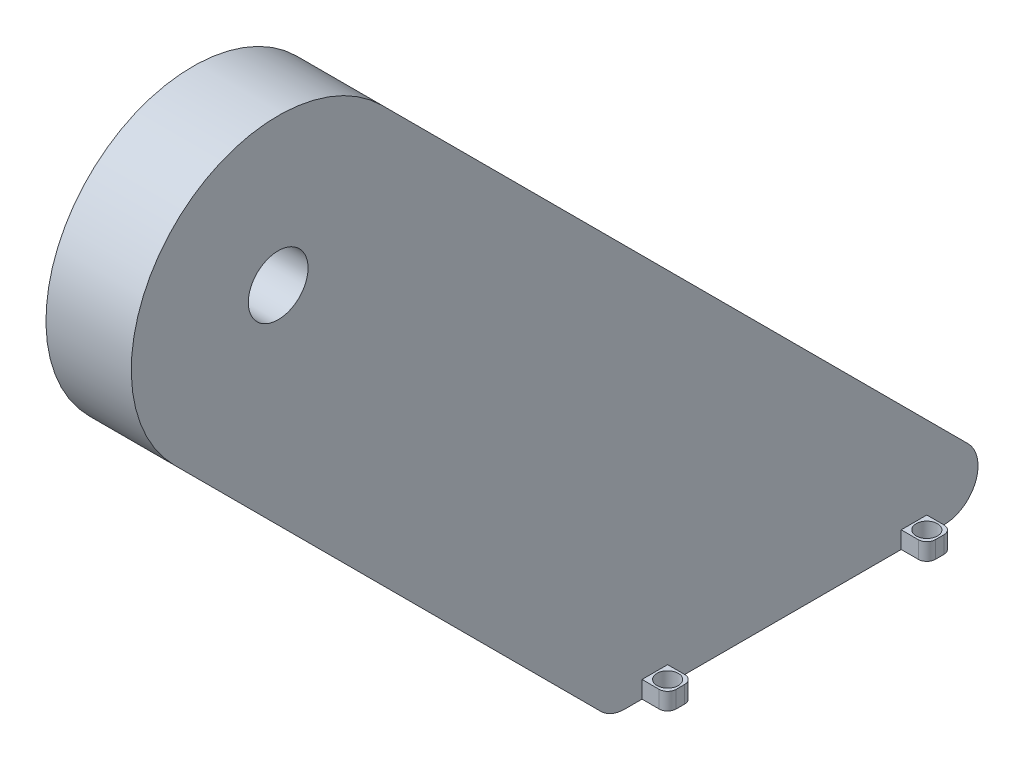
ISO-10303-21;
HEADER;
FILE_DESCRIPTION(('STEP AP214'),'2;1');
FILE_NAME('part.step','',(''),(''),'','','');
FILE_SCHEMA(('AUTOMOTIVE_DESIGN { 1 0 10303 214 1 1 1 1 }'));
ENDSEC;
DATA;
#1=APPLICATION_CONTEXT('core data for automotive mechanical design processes');
#2=APPLICATION_PROTOCOL_DEFINITION('international standard','automotive_design',2000,#1);
#3=PRODUCT_CONTEXT('',#1,'mechanical');
#4=PRODUCT('Part','Part','',(#3));
#5=PRODUCT_RELATED_PRODUCT_CATEGORY('part','',(#4));
#6=PRODUCT_DEFINITION_FORMATION('','',#4);
#7=PRODUCT_DEFINITION_CONTEXT('part definition',#1,'design');
#8=PRODUCT_DEFINITION('design','',#6,#7);
#9=PRODUCT_DEFINITION_SHAPE('','',#8);
#10=(LENGTH_UNIT() NAMED_UNIT(*) SI_UNIT(.MILLI.,.METRE.));
#11=(NAMED_UNIT(*) PLANE_ANGLE_UNIT() SI_UNIT($,.RADIAN.));
#12=(NAMED_UNIT(*) SI_UNIT($,.STERADIAN.) SOLID_ANGLE_UNIT());
#13=UNCERTAINTY_MEASURE_WITH_UNIT(LENGTH_MEASURE(1.E-05),#10,'distance_accuracy_value','');
#14=(GEOMETRIC_REPRESENTATION_CONTEXT(3) GLOBAL_UNCERTAINTY_ASSIGNED_CONTEXT((#13)) GLOBAL_UNIT_ASSIGNED_CONTEXT((#10,
#11,#12)) REPRESENTATION_CONTEXT('',''));
#15=CARTESIAN_POINT('',(0.,0.,0.));
#16=DIRECTION('',(0.,0.,1.));
#17=DIRECTION('',(1.,0.,0.));
#18=AXIS2_PLACEMENT_3D('',#15,#16,#17);
#19=CARTESIAN_POINT('',(10.,4.,-24.0294372494924));
#20=DIRECTION('',(1.,0.,0.));
#21=DIRECTION('',(0.,0.,-1.));
#22=AXIS2_PLACEMENT_3D('',#19,#20,#21);
#23=PLANE('',#22);
#24=DIRECTION('',(0.,-1.,0.));
#25=VECTOR('',#24,1.);
#26=CARTESIAN_POINT('',(10.,2.,-19.0294372494924));
#27=LINE('',#26,#25);
#28=CARTESIAN_POINT('',(10.,2.,-19.0294372494924));
#29=VERTEX_POINT('',#28);
#30=CARTESIAN_POINT('',(10.,0.,-19.0294372494924));
#31=VERTEX_POINT('',#30);
#32=EDGE_CURVE('E184',#29,#31,#27,.T.);
#33=ORIENTED_EDGE('',*,*,#32,.F.);
#34=DIRECTION('',(0.,0.,-1.));
#35=VECTOR('',#34,1.);
#36=CARTESIAN_POINT('',(10.,2.,-19.0294372494924));
#37=LINE('',#36,#35);
#38=CARTESIAN_POINT('',(10.,2.,-22.0294372494924));
#39=VERTEX_POINT('',#38);
#40=EDGE_CURVE('E182',#29,#39,#37,.T.);
#41=ORIENTED_EDGE('',*,*,#40,.T.);
#42=DIRECTION('',(0.,-1.,0.));
#43=VECTOR('',#42,1.);
#44=CARTESIAN_POINT('',(10.,2.,-22.0294372494924));
#45=LINE('',#44,#43);
#46=CARTESIAN_POINT('',(10.,0.,-22.0294372494924));
#47=VERTEX_POINT('',#46);
#48=EDGE_CURVE('E178',#39,#47,#45,.T.);
#49=ORIENTED_EDGE('',*,*,#48,.T.);
#50=DIRECTION('',(0.,0.,-1.));
#51=VECTOR('',#50,1.);
#52=CARTESIAN_POINT('',(10.,0.,0.));
#53=LINE('',#52,#51);
#54=CARTESIAN_POINT('',(10.,0.,-24.0294372494924));
#55=VERTEX_POINT('',#54);
#56=EDGE_CURVE('E162',#47,#55,#53,.T.);
#57=ORIENTED_EDGE('',*,*,#56,.T.);
#58=CARTESIAN_POINT('',(10.,4.,-24.0294372494924));
#59=DIRECTION('',(1.,0.,0.));
#60=DIRECTION('',(0.,0.,-1.));
#61=AXIS2_PLACEMENT_3D('',#58,#59,#60);
#62=CIRCLE('',#61,4.);
#63=CARTESIAN_POINT('',(10.,6.82842712474619,-26.8578643742386));
#64=VERTEX_POINT('',#63);
#65=EDGE_CURVE('E240',#55,#64,#62,.T.);
#66=ORIENTED_EDGE('',*,*,#65,.T.);
#67=DIRECTION('',(0.,0.707106781186547,0.707106781186547));
#68=VECTOR('',#67,1.);
#69=CARTESIAN_POINT('',(10.,6.82842712474619,-26.8578643742386));
#70=LINE('',#69,#68);
#71=CARTESIAN_POINT('',(10.,75.4974746744259,41.8111831754411));
#72=VERTEX_POINT('',#71);
#73=EDGE_CURVE('E242',#64,#72,#70,.T.);
#74=ORIENTED_EDGE('',*,*,#73,.T.);
#75=CARTESIAN_POINT('',(10.,63.3259017996797,53.9827560501873));
#76=DIRECTION('',(1.,0.,0.));
#77=DIRECTION('',(0.,0.,-1.));
#78=AXIS2_PLACEMENT_3D('',#75,#76,#77);
#79=CIRCLE('',#78,17.2132034348785);
#80=CARTESIAN_POINT('',(10.,51.1543289249335,66.1543289249335));
#81=VERTEX_POINT('',#80);
#82=EDGE_CURVE('E244',#72,#81,#79,.T.);
#83=ORIENTED_EDGE('',*,*,#82,.T.);
#84=DIRECTION('',(0.,-0.707106781186548,-0.707106781186547));
#85=VECTOR('',#84,1.);
#86=CARTESIAN_POINT('',(10.,1.17157287525383,16.1715728752538));
#87=LINE('',#86,#85);
#88=CARTESIAN_POINT('',(10.,1.17157287525383,16.1715728752538));
#89=VERTEX_POINT('',#88);
#90=EDGE_CURVE('E246',#81,#89,#87,.T.);
#91=ORIENTED_EDGE('',*,*,#90,.T.);
#92=CARTESIAN_POINT('',(10.,4.,13.3431457505076));
#93=DIRECTION('',(1.,0.,0.));
#94=DIRECTION('',(0.,0.,1.));
#95=AXIS2_PLACEMENT_3D('',#92,#93,#94);
#96=CIRCLE('',#95,4.);
#97=CARTESIAN_POINT('',(10.,0.,13.3431457505076));
#98=VERTEX_POINT('',#97);
#99=EDGE_CURVE('E248',#89,#98,#96,.T.);
#100=ORIENTED_EDGE('',*,*,#99,.T.);
#101=CARTESIAN_POINT('',(10.,0.,11.3431457505076));
#102=VERTEX_POINT('',#101);
#103=EDGE_CURVE('E176',#98,#102,#53,.T.);
#104=ORIENTED_EDGE('',*,*,#103,.T.);
#105=DIRECTION('',(0.,-1.,0.));
#106=VECTOR('',#105,1.);
#107=CARTESIAN_POINT('',(10.,2.,11.3431457505076));
#108=LINE('',#107,#106);
#109=CARTESIAN_POINT('',(10.,2.,11.3431457505076));
#110=VERTEX_POINT('',#109);
#111=EDGE_CURVE('E227',#110,#102,#108,.T.);
#112=ORIENTED_EDGE('',*,*,#111,.F.);
#113=DIRECTION('',(0.,0.,-1.));
#114=VECTOR('',#113,1.);
#115=CARTESIAN_POINT('',(10.,2.,11.3431457505076));
#116=LINE('',#115,#114);
#117=CARTESIAN_POINT('',(10.,2.,8.3431457505076));
#118=VERTEX_POINT('',#117);
#119=EDGE_CURVE('E210',#110,#118,#116,.T.);
#120=ORIENTED_EDGE('',*,*,#119,.T.);
#121=DIRECTION('',(0.,-1.,0.));
#122=VECTOR('',#121,1.);
#123=CARTESIAN_POINT('',(10.,2.,8.3431457505076));
#124=LINE('',#123,#122);
#125=CARTESIAN_POINT('',(10.,0.,8.3431457505076));
#126=VERTEX_POINT('',#125);
#127=EDGE_CURVE('E221',#118,#126,#124,.T.);
#128=ORIENTED_EDGE('',*,*,#127,.T.);
#129=EDGE_CURVE('E173',#126,#31,#53,.T.);
#130=ORIENTED_EDGE('',*,*,#129,.T.);
#131=EDGE_LOOP('',(#33,#41,#49,#57,#66,#74,#83,#91,#100,#104,#112,#120,#128,#130));
#132=FACE_BOUND('',#131,.T.);
#133=CARTESIAN_POINT('',(10.,63.3259017996797,53.9827560501873));
#134=DIRECTION('',(1.,0.,0.));
#135=DIRECTION('',(0.,0.,-1.));
#136=AXIS2_PLACEMENT_3D('',#133,#134,#135);
#137=CIRCLE('',#136,3.5);
#138=CARTESIAN_POINT('',(10.,63.3259017996797,50.4827560501873));
#139=VERTEX_POINT('',#138);
#140=EDGE_CURVE('E233',#139,#139,#137,.T.);
#141=ORIENTED_EDGE('',*,*,#140,.F.);
#142=EDGE_LOOP('',(#141));
#143=FACE_BOUND('',#142,.T.);
#144=ADVANCED_FACE('F34',(#132,#143),#23,.T.);
#145=CARTESIAN_POINT('',(0.,4.,-24.0294372494924));
#146=DIRECTION('',(1.,0.,0.));
#147=DIRECTION('',(0.,0.,-1.));
#148=AXIS2_PLACEMENT_3D('',#145,#146,#147);
#149=PLANE('',#148);
#150=CARTESIAN_POINT('',(0.,4.,-24.0294372494924));
#151=DIRECTION('',(1.,0.,0.));
#152=DIRECTION('',(0.,0.,-1.));
#153=AXIS2_PLACEMENT_3D('',#150,#151,#152);
#154=CIRCLE('',#153,4.);
#155=CARTESIAN_POINT('',(0.,0.,-24.0294372494924));
#156=VERTEX_POINT('',#155);
#157=CARTESIAN_POINT('',(0.,6.82842712474619,-26.8578643742386));
#158=VERTEX_POINT('',#157);
#159=EDGE_CURVE('E236',#156,#158,#154,.T.);
#160=ORIENTED_EDGE('',*,*,#159,.F.);
#161=DIRECTION('',(0.,0.,-1.));
#162=VECTOR('',#161,1.);
#163=CARTESIAN_POINT('',(0.,0.,0.));
#164=LINE('',#163,#162);
#165=CARTESIAN_POINT('',(0.,0.,13.3431457505076));
#166=VERTEX_POINT('',#165);
#167=EDGE_CURVE('E174',#166,#156,#164,.T.);
#168=ORIENTED_EDGE('',*,*,#167,.F.);
#169=CARTESIAN_POINT('',(0.,4.,13.3431457505076));
#170=DIRECTION('',(1.,0.,0.));
#171=DIRECTION('',(0.,0.,1.));
#172=AXIS2_PLACEMENT_3D('',#169,#170,#171);
#173=CIRCLE('',#172,4.);
#174=CARTESIAN_POINT('',(0.,1.17157287525383,16.1715728752538));
#175=VERTEX_POINT('',#174);
#176=EDGE_CURVE('E259',#175,#166,#173,.T.);
#177=ORIENTED_EDGE('',*,*,#176,.F.);
#178=DIRECTION('',(0.,-0.707106781186548,-0.707106781186547));
#179=VECTOR('',#178,1.);
#180=CARTESIAN_POINT('',(0.,1.17157287525383,16.1715728752538));
#181=LINE('',#180,#179);
#182=CARTESIAN_POINT('',(0.,51.1543289249335,66.1543289249335));
#183=VERTEX_POINT('',#182);
#184=EDGE_CURVE('E257',#183,#175,#181,.T.);
#185=ORIENTED_EDGE('',*,*,#184,.F.);
#186=CARTESIAN_POINT('',(0.,63.3259017996797,53.9827560501873));
#187=DIRECTION('',(1.,0.,0.));
#188=DIRECTION('',(0.,0.,-1.));
#189=AXIS2_PLACEMENT_3D('',#186,#187,#188);
#190=CIRCLE('',#189,17.2132034348785);
#191=CARTESIAN_POINT('',(0.,75.4974746744259,41.8111831754411));
#192=VERTEX_POINT('',#191);
#193=EDGE_CURVE('E255',#192,#183,#190,.T.);
#194=ORIENTED_EDGE('',*,*,#193,.F.);
#195=DIRECTION('',(0.,0.707106781186547,0.707106781186547));
#196=VECTOR('',#195,1.);
#197=CARTESIAN_POINT('',(0.,6.82842712474619,-26.8578643742386));
#198=LINE('',#197,#196);
#199=EDGE_CURVE('E253',#158,#192,#198,.T.);
#200=ORIENTED_EDGE('',*,*,#199,.F.);
#201=EDGE_LOOP('',(#160,#168,#177,#185,#194,#200));
#202=FACE_BOUND('',#201,.T.);
#203=CARTESIAN_POINT('',(0.,63.3259017996797,53.9827560501873));
#204=DIRECTION('',(1.,0.,0.));
#205=DIRECTION('',(0.,0.,-1.));
#206=AXIS2_PLACEMENT_3D('',#203,#204,#205);
#207=CIRCLE('',#206,3.5);
#208=CARTESIAN_POINT('',(0.,63.3259017996797,50.4827560501873));
#209=VERTEX_POINT('',#208);
#210=EDGE_CURVE('E230',#209,#209,#207,.T.);
#211=ORIENTED_EDGE('',*,*,#210,.T.);
#212=EDGE_LOOP('',(#211));
#213=FACE_BOUND('',#212,.T.);
#214=ADVANCED_FACE('F345',(#202,#213),#149,.F.);
#215=CARTESIAN_POINT('',(10.,4.,-24.0294372494924));
#216=DIRECTION('',(-1.,0.,0.));
#217=DIRECTION('',(0.,0.,1.));
#218=AXIS2_PLACEMENT_3D('',#215,#216,#217);
#219=CYLINDRICAL_SURFACE('',#218,4.);
#220=ORIENTED_EDGE('',*,*,#159,.T.);
#221=DIRECTION('',(-1.,0.,0.));
#222=VECTOR('',#221,1.);
#223=CARTESIAN_POINT('',(10.,6.82842712474619,-26.8578643742386));
#224=LINE('',#223,#222);
#225=EDGE_CURVE('E273',#64,#158,#224,.T.);
#226=ORIENTED_EDGE('',*,*,#225,.F.);
#227=ORIENTED_EDGE('',*,*,#65,.F.);
#228=DIRECTION('',(-1.,0.,0.));
#229=VECTOR('',#228,1.);
#230=CARTESIAN_POINT('',(10.,0.,-24.0294372494924));
#231=LINE('',#230,#229);
#232=EDGE_CURVE('E170',#55,#156,#231,.T.);
#233=ORIENTED_EDGE('',*,*,#232,.T.);
#234=EDGE_LOOP('',(#220,#226,#227,#233));
#235=FACE_BOUND('',#234,.T.);
#236=ADVANCED_FACE('F350',(#235),#219,.T.);
#237=CARTESIAN_POINT('',(10.,6.82842712474619,-26.8578643742386));
#238=DIRECTION('',(0.,-0.707106781186548,0.707106781186548));
#239=DIRECTION('',(0.,-0.707106781186548,-0.707106781186548));
#240=AXIS2_PLACEMENT_3D('',#237,#238,#239);
#241=PLANE('',#240);
#242=ORIENTED_EDGE('',*,*,#199,.T.);
#243=DIRECTION('',(-1.,0.,0.));
#244=VECTOR('',#243,1.);
#245=CARTESIAN_POINT('',(10.,75.4974746744259,41.8111831754411));
#246=LINE('',#245,#244);
#247=EDGE_CURVE('E270',#72,#192,#246,.T.);
#248=ORIENTED_EDGE('',*,*,#247,.F.);
#249=ORIENTED_EDGE('',*,*,#73,.F.);
#250=ORIENTED_EDGE('',*,*,#225,.T.);
#251=EDGE_LOOP('',(#242,#248,#249,#250));
#252=FACE_BOUND('',#251,.T.);
#253=ADVANCED_FACE('F521',(#252),#241,.F.);
#254=CARTESIAN_POINT('',(10.,63.3259017996797,53.9827560501873));
#255=DIRECTION('',(-1.,0.,0.));
#256=DIRECTION('',(0.,0.,1.));
#257=AXIS2_PLACEMENT_3D('',#254,#255,#256);
#258=CYLINDRICAL_SURFACE('',#257,17.2132034348785);
#259=ORIENTED_EDGE('',*,*,#193,.T.);
#260=DIRECTION('',(-1.,0.,0.));
#261=VECTOR('',#260,1.);
#262=CARTESIAN_POINT('',(10.,51.1543289249335,66.1543289249335));
#263=LINE('',#262,#261);
#264=EDGE_CURVE('E267',#81,#183,#263,.T.);
#265=ORIENTED_EDGE('',*,*,#264,.F.);
#266=ORIENTED_EDGE('',*,*,#82,.F.);
#267=ORIENTED_EDGE('',*,*,#247,.T.);
#268=EDGE_LOOP('',(#259,#265,#266,#267));
#269=FACE_BOUND('',#268,.T.);
#270=ADVANCED_FACE('F511',(#269),#258,.T.);
#271=CARTESIAN_POINT('',(10.,1.17157287525383,16.1715728752538));
#272=DIRECTION('',(0.,0.707106781186547,-0.707106781186548));
#273=DIRECTION('',(0.,0.707106781186548,0.707106781186547));
#274=AXIS2_PLACEMENT_3D('',#271,#272,#273);
#275=PLANE('',#274);
#276=ORIENTED_EDGE('',*,*,#184,.T.);
#277=DIRECTION('',(-1.,0.,0.));
#278=VECTOR('',#277,1.);
#279=CARTESIAN_POINT('',(10.,1.17157287525383,16.1715728752538));
#280=LINE('',#279,#278);
#281=EDGE_CURVE('E264',#89,#175,#280,.T.);
#282=ORIENTED_EDGE('',*,*,#281,.F.);
#283=ORIENTED_EDGE('',*,*,#90,.F.);
#284=ORIENTED_EDGE('',*,*,#264,.T.);
#285=EDGE_LOOP('',(#276,#282,#283,#284));
#286=FACE_BOUND('',#285,.T.);
#287=ADVANCED_FACE('F340',(#286),#275,.F.);
#288=CARTESIAN_POINT('',(10.,4.,13.3431457505076));
#289=DIRECTION('',(-1.,0.,0.));
#290=DIRECTION('',(0.,0.,1.));
#291=AXIS2_PLACEMENT_3D('',#288,#289,#290);
#292=CYLINDRICAL_SURFACE('',#291,4.);
#293=ORIENTED_EDGE('',*,*,#176,.T.);
#294=DIRECTION('',(-1.,0.,0.));
#295=VECTOR('',#294,1.);
#296=CARTESIAN_POINT('',(10.,0.,13.3431457505076));
#297=LINE('',#296,#295);
#298=EDGE_CURVE('E251',#98,#166,#297,.T.);
#299=ORIENTED_EDGE('',*,*,#298,.F.);
#300=ORIENTED_EDGE('',*,*,#99,.F.);
#301=ORIENTED_EDGE('',*,*,#281,.T.);
#302=EDGE_LOOP('',(#293,#299,#300,#301));
#303=FACE_BOUND('',#302,.T.);
#304=ADVANCED_FACE('F331',(#303),#292,.T.);
#305=CARTESIAN_POINT('',(10.,0.,0.));
#306=DIRECTION('',(0.,1.,0.));
#307=DIRECTION('',(0.,0.,1.));
#308=AXIS2_PLACEMENT_3D('',#305,#306,#307);
#309=PLANE('',#308);
#310=DIRECTION('',(0.,0.,1.));
#311=VECTOR('',#310,1.);
#312=CARTESIAN_POINT('',(13.,0.,-19.0294372494924));
#313=LINE('',#312,#311);
#314=CARTESIAN_POINT('',(13.,0.,-21.0294372494924));
#315=VERTEX_POINT('',#314);
#316=CARTESIAN_POINT('',(13.,0.,-20.0294372494924));
#317=VERTEX_POINT('',#316);
#318=EDGE_CURVE('E189',#315,#317,#313,.T.);
#319=ORIENTED_EDGE('',*,*,#318,.T.);
#320=CARTESIAN_POINT('',(12.,0.,-20.0294372494924));
#321=DIRECTION('',(0.,1.,0.));
#322=DIRECTION('',(0.,0.,1.));
#323=AXIS2_PLACEMENT_3D('',#320,#321,#322);
#324=CIRCLE('',#323,1.);
#325=CARTESIAN_POINT('',(12.,0.,-19.0294372494924));
#326=VERTEX_POINT('',#325);
#327=EDGE_CURVE('E303',#317,#326,#324,.F.);
#328=ORIENTED_EDGE('',*,*,#327,.T.);
#329=DIRECTION('',(-1.,0.,0.));
#330=VECTOR('',#329,1.);
#331=CARTESIAN_POINT('',(10.,0.,-19.0294372494924));
#332=LINE('',#331,#330);
#333=EDGE_CURVE('E192',#326,#31,#332,.T.);
#334=ORIENTED_EDGE('',*,*,#333,.T.);
#335=ORIENTED_EDGE('',*,*,#129,.F.);
#336=DIRECTION('',(1.,0.,0.));
#337=VECTOR('',#336,1.);
#338=CARTESIAN_POINT('',(10.,0.,8.3431457505076));
#339=LINE('',#338,#337);
#340=CARTESIAN_POINT('',(12.,0.,8.3431457505076));
#341=VERTEX_POINT('',#340);
#342=EDGE_CURVE('E207',#126,#341,#339,.T.);
#343=ORIENTED_EDGE('',*,*,#342,.T.);
#344=CARTESIAN_POINT('',(12.,0.,9.3431457505076));
#345=DIRECTION('',(0.,1.,0.));
#346=DIRECTION('',(0.,0.,1.));
#347=AXIS2_PLACEMENT_3D('',#344,#345,#346);
#348=CIRCLE('',#347,1.);
#349=CARTESIAN_POINT('',(13.,0.,9.3431457505076));
#350=VERTEX_POINT('',#349);
#351=EDGE_CURVE('E290',#341,#350,#348,.F.);
#352=ORIENTED_EDGE('',*,*,#351,.T.);
#353=DIRECTION('',(0.,0.,1.));
#354=VECTOR('',#353,1.);
#355=CARTESIAN_POINT('',(13.,0.,11.3431457505076));
#356=LINE('',#355,#354);
#357=CARTESIAN_POINT('',(13.,0.,10.3431457505076));
#358=VERTEX_POINT('',#357);
#359=EDGE_CURVE('E224',#350,#358,#356,.T.);
#360=ORIENTED_EDGE('',*,*,#359,.T.);
#361=CARTESIAN_POINT('',(12.,0.,10.3431457505076));
#362=DIRECTION('',(0.,1.,0.));
#363=DIRECTION('',(0.,0.,1.));
#364=AXIS2_PLACEMENT_3D('',#361,#362,#363);
#365=CIRCLE('',#364,1.);
#366=CARTESIAN_POINT('',(12.,0.,11.3431457505076));
#367=VERTEX_POINT('',#366);
#368=EDGE_CURVE('E280',#358,#367,#365,.F.);
#369=ORIENTED_EDGE('',*,*,#368,.T.);
#370=DIRECTION('',(-1.,0.,0.));
#371=VECTOR('',#370,1.);
#372=CARTESIAN_POINT('',(10.,0.,11.3431457505076));
#373=LINE('',#372,#371);
#374=EDGE_CURVE('E214',#367,#102,#373,.T.);
#375=ORIENTED_EDGE('',*,*,#374,.T.);
#376=ORIENTED_EDGE('',*,*,#103,.F.);
#377=ORIENTED_EDGE('',*,*,#298,.T.);
#378=ORIENTED_EDGE('',*,*,#167,.T.);
#379=ORIENTED_EDGE('',*,*,#232,.F.);
#380=ORIENTED_EDGE('',*,*,#56,.F.);
#381=DIRECTION('',(1.,0.,0.));
#382=VECTOR('',#381,1.);
#383=CARTESIAN_POINT('',(10.,0.,-22.0294372494924));
#384=LINE('',#383,#382);
#385=CARTESIAN_POINT('',(12.,0.,-22.0294372494924));
#386=VERTEX_POINT('',#385);
#387=EDGE_CURVE('E168',#47,#386,#384,.T.);
#388=ORIENTED_EDGE('',*,*,#387,.T.);
#389=CARTESIAN_POINT('',(12.,0.,-21.0294372494924));
#390=DIRECTION('',(0.,1.,0.));
#391=DIRECTION('',(0.,0.,1.));
#392=AXIS2_PLACEMENT_3D('',#389,#390,#391);
#393=CIRCLE('',#392,1.);
#394=EDGE_CURVE('E301',#386,#315,#393,.F.);
#395=ORIENTED_EDGE('',*,*,#394,.T.);
#396=EDGE_LOOP('',(#319,#328,#334,#335,#343,#352,#360,#369,#375,#376,#377,#378,#379,#380,#388,#395));
#397=FACE_BOUND('',#396,.T.);
#398=CARTESIAN_POINT('',(11.5,0.,9.8431457505076));
#399=DIRECTION('',(0.,-1.,0.));
#400=DIRECTION('',(0.,0.,-1.));
#401=AXIS2_PLACEMENT_3D('',#398,#399,#400);
#402=CIRCLE('',#401,1.25);
#403=CARTESIAN_POINT('',(11.5,0.,8.5931457505076));
#404=VERTEX_POINT('',#403);
#405=EDGE_CURVE('E202',#404,#404,#402,.T.);
#406=ORIENTED_EDGE('',*,*,#405,.F.);
#407=EDGE_LOOP('',(#406));
#408=FACE_BOUND('',#407,.T.);
#409=CARTESIAN_POINT('',(11.5,0.,-20.5294372494924));
#410=DIRECTION('',(0.,-1.,0.));
#411=DIRECTION('',(0.,0.,-1.));
#412=AXIS2_PLACEMENT_3D('',#409,#410,#411);
#413=CIRCLE('',#412,1.25);
#414=CARTESIAN_POINT('',(11.5,0.,-21.7794372494924));
#415=VERTEX_POINT('',#414);
#416=EDGE_CURVE('E195',#415,#415,#413,.T.);
#417=ORIENTED_EDGE('',*,*,#416,.F.);
#418=EDGE_LOOP('',(#417));
#419=FACE_BOUND('',#418,.T.);
#420=ADVANCED_FACE('F165',(#397,#408,#419),#309,.F.);
#421=CARTESIAN_POINT('',(10.,63.3259017996797,53.9827560501873));
#422=DIRECTION('',(-1.,0.,0.));
#423=DIRECTION('',(0.,0.,1.));
#424=AXIS2_PLACEMENT_3D('',#421,#422,#423);
#425=CYLINDRICAL_SURFACE('',#424,3.5);
#426=ORIENTED_EDGE('',*,*,#140,.T.);
#427=EDGE_LOOP('',(#426));
#428=FACE_BOUND('',#427,.T.);
#429=ORIENTED_EDGE('',*,*,#210,.F.);
#430=EDGE_LOOP('',(#429));
#431=FACE_BOUND('',#430,.T.);
#432=ADVANCED_FACE('F330',(#428,#431),#425,.F.);
#433=CARTESIAN_POINT('',(10.,2.,11.3431457505076));
#434=DIRECTION('',(0.,0.,1.));
#435=DIRECTION('',(1.,0.,0.));
#436=AXIS2_PLACEMENT_3D('',#433,#434,#435);
#437=PLANE('',#436);
#438=ORIENTED_EDGE('',*,*,#374,.F.);
#439=DIRECTION('',(0.,-1.,0.));
#440=VECTOR('',#439,1.);
#441=CARTESIAN_POINT('',(12.,2.,11.3431457505076));
#442=LINE('',#441,#440);
#443=CARTESIAN_POINT('',(12.,2.,11.3431457505076));
#444=VERTEX_POINT('',#443);
#445=EDGE_CURVE('E282',#367,#444,#442,.F.);
#446=ORIENTED_EDGE('',*,*,#445,.T.);
#447=DIRECTION('',(-1.,0.,0.));
#448=VECTOR('',#447,1.);
#449=CARTESIAN_POINT('',(10.,2.,11.3431457505076));
#450=LINE('',#449,#448);
#451=EDGE_CURVE('E219',#444,#110,#450,.T.);
#452=ORIENTED_EDGE('',*,*,#451,.T.);
#453=ORIENTED_EDGE('',*,*,#111,.T.);
#454=EDGE_LOOP('',(#438,#446,#452,#453));
#455=FACE_BOUND('',#454,.T.);
#456=ADVANCED_FACE('F337',(#455),#437,.T.);
#457=CARTESIAN_POINT('',(13.,2.,11.3431457505076));
#458=DIRECTION('',(1.,0.,0.));
#459=DIRECTION('',(0.,0.,-1.));
#460=AXIS2_PLACEMENT_3D('',#457,#458,#459);
#461=PLANE('',#460);
#462=ORIENTED_EDGE('',*,*,#359,.F.);
#463=DIRECTION('',(0.,-1.,0.));
#464=VECTOR('',#463,1.);
#465=CARTESIAN_POINT('',(13.,2.,9.3431457505076));
#466=LINE('',#465,#464);
#467=CARTESIAN_POINT('',(13.,2.,9.3431457505076));
#468=VERTEX_POINT('',#467);
#469=EDGE_CURVE('E292',#350,#468,#466,.F.);
#470=ORIENTED_EDGE('',*,*,#469,.T.);
#471=DIRECTION('',(0.,0.,1.));
#472=VECTOR('',#471,1.);
#473=CARTESIAN_POINT('',(13.,2.,11.3431457505076));
#474=LINE('',#473,#472);
#475=CARTESIAN_POINT('',(13.,2.,10.3431457505076));
#476=VERTEX_POINT('',#475);
#477=EDGE_CURVE('E217',#468,#476,#474,.T.);
#478=ORIENTED_EDGE('',*,*,#477,.T.);
#479=DIRECTION('',(0.,-1.,0.));
#480=VECTOR('',#479,1.);
#481=CARTESIAN_POINT('',(13.,2.,10.3431457505076));
#482=LINE('',#481,#480);
#483=EDGE_CURVE('E277',#476,#358,#482,.T.);
#484=ORIENTED_EDGE('',*,*,#483,.T.);
#485=EDGE_LOOP('',(#462,#470,#478,#484));
#486=FACE_BOUND('',#485,.T.);
#487=ADVANCED_FACE('F357',(#486),#461,.T.);
#488=CARTESIAN_POINT('',(10.,2.,8.3431457505076));
#489=DIRECTION('',(0.,0.,-1.));
#490=DIRECTION('',(-1.,0.,0.));
#491=AXIS2_PLACEMENT_3D('',#488,#489,#490);
#492=PLANE('',#491);
#493=DIRECTION('',(1.,0.,0.));
#494=VECTOR('',#493,1.);
#495=CARTESIAN_POINT('',(10.,2.,8.3431457505076));
#496=LINE('',#495,#494);
#497=CARTESIAN_POINT('',(12.,2.,8.3431457505076));
#498=VERTEX_POINT('',#497);
#499=EDGE_CURVE('E213',#118,#498,#496,.T.);
#500=ORIENTED_EDGE('',*,*,#499,.T.);
#501=DIRECTION('',(0.,-1.,0.));
#502=VECTOR('',#501,1.);
#503=CARTESIAN_POINT('',(12.,2.,8.3431457505076));
#504=LINE('',#503,#502);
#505=EDGE_CURVE('E287',#498,#341,#504,.T.);
#506=ORIENTED_EDGE('',*,*,#505,.T.);
#507=ORIENTED_EDGE('',*,*,#342,.F.);
#508=ORIENTED_EDGE('',*,*,#127,.F.);
#509=EDGE_LOOP('',(#500,#506,#507,#508));
#510=FACE_BOUND('',#509,.T.);
#511=ADVANCED_FACE('F353',(#510),#492,.T.);
#512=CARTESIAN_POINT('',(0.,2.,0.));
#513=DIRECTION('',(0.,-1.,0.));
#514=DIRECTION('',(0.,0.,-1.));
#515=AXIS2_PLACEMENT_3D('',#512,#513,#514);
#516=PLANE('',#515);
#517=CARTESIAN_POINT('',(11.5,2.,9.8431457505076));
#518=DIRECTION('',(0.,-1.,0.));
#519=DIRECTION('',(0.,0.,-1.));
#520=AXIS2_PLACEMENT_3D('',#517,#518,#519);
#521=CIRCLE('',#520,1.25);
#522=CARTESIAN_POINT('',(11.5,2.,8.5931457505076));
#523=VERTEX_POINT('',#522);
#524=EDGE_CURVE('E204',#523,#523,#521,.T.);
#525=ORIENTED_EDGE('',*,*,#524,.T.);
#526=EDGE_LOOP('',(#525));
#527=FACE_BOUND('',#526,.T.);
#528=ORIENTED_EDGE('',*,*,#477,.F.);
#529=CARTESIAN_POINT('',(12.,2.,9.3431457505076));
#530=DIRECTION('',(0.,-1.,0.));
#531=DIRECTION('',(0.,0.,-1.));
#532=AXIS2_PLACEMENT_3D('',#529,#530,#531);
#533=CIRCLE('',#532,1.);
#534=EDGE_CURVE('E294',#468,#498,#533,.F.);
#535=ORIENTED_EDGE('',*,*,#534,.T.);
#536=ORIENTED_EDGE('',*,*,#499,.F.);
#537=ORIENTED_EDGE('',*,*,#119,.F.);
#538=ORIENTED_EDGE('',*,*,#451,.F.);
#539=CARTESIAN_POINT('',(12.,2.,10.3431457505076));
#540=DIRECTION('',(0.,-1.,0.));
#541=DIRECTION('',(0.,0.,-1.));
#542=AXIS2_PLACEMENT_3D('',#539,#540,#541);
#543=CIRCLE('',#542,1.);
#544=EDGE_CURVE('E284',#444,#476,#543,.F.);
#545=ORIENTED_EDGE('',*,*,#544,.T.);
#546=EDGE_LOOP('',(#528,#535,#536,#537,#538,#545));
#547=FACE_BOUND('',#546,.T.);
#548=ADVANCED_FACE('F356',(#527,#547),#516,.F.);
#549=CARTESIAN_POINT('',(11.5,2.,9.8431457505076));
#550=DIRECTION('',(0.,-1.,0.));
#551=DIRECTION('',(0.,0.,-1.));
#552=AXIS2_PLACEMENT_3D('',#549,#550,#551);
#553=CYLINDRICAL_SURFACE('',#552,1.25);
#554=ORIENTED_EDGE('',*,*,#524,.F.);
#555=EDGE_LOOP('',(#554));
#556=FACE_BOUND('',#555,.T.);
#557=ORIENTED_EDGE('',*,*,#405,.T.);
#558=EDGE_LOOP('',(#557));
#559=FACE_BOUND('',#558,.T.);
#560=ADVANCED_FACE('F367',(#556,#559),#553,.F.);
#561=CARTESIAN_POINT('',(10.,2.,-19.0294372494924));
#562=DIRECTION('',(0.,0.,1.));
#563=DIRECTION('',(1.,0.,0.));
#564=AXIS2_PLACEMENT_3D('',#561,#562,#563);
#565=PLANE('',#564);
#566=ORIENTED_EDGE('',*,*,#333,.F.);
#567=DIRECTION('',(0.,-1.,0.));
#568=VECTOR('',#567,1.);
#569=CARTESIAN_POINT('',(12.,2.,-19.0294372494924));
#570=LINE('',#569,#568);
#571=CARTESIAN_POINT('',(12.,2.,-19.0294372494924));
#572=VERTEX_POINT('',#571);
#573=EDGE_CURVE('E57',#326,#572,#570,.F.);
#574=ORIENTED_EDGE('',*,*,#573,.T.);
#575=DIRECTION('',(-1.,0.,0.));
#576=VECTOR('',#575,1.);
#577=CARTESIAN_POINT('',(10.,2.,-19.0294372494924));
#578=LINE('',#577,#576);
#579=EDGE_CURVE('E185',#572,#29,#578,.T.);
#580=ORIENTED_EDGE('',*,*,#579,.T.);
#581=ORIENTED_EDGE('',*,*,#32,.T.);
#582=EDGE_LOOP('',(#566,#574,#580,#581));
#583=FACE_BOUND('',#582,.T.);
#584=ADVANCED_FACE('F320',(#583),#565,.T.);
#585=CARTESIAN_POINT('',(13.,2.,-19.0294372494924));
#586=DIRECTION('',(1.,0.,0.));
#587=DIRECTION('',(0.,0.,-1.));
#588=AXIS2_PLACEMENT_3D('',#585,#586,#587);
#589=PLANE('',#588);
#590=DIRECTION('',(0.,0.,1.));
#591=VECTOR('',#590,1.);
#592=CARTESIAN_POINT('',(13.,2.,-19.0294372494924));
#593=LINE('',#592,#591);
#594=CARTESIAN_POINT('',(13.,2.,-21.0294372494924));
#595=VERTEX_POINT('',#594);
#596=CARTESIAN_POINT('',(13.,2.,-20.0294372494924));
#597=VERTEX_POINT('',#596);
#598=EDGE_CURVE('E309',#595,#597,#593,.T.);
#599=ORIENTED_EDGE('',*,*,#598,.T.);
#600=DIRECTION('',(0.,-1.,0.));
#601=VECTOR('',#600,1.);
#602=CARTESIAN_POINT('',(13.,2.,-20.0294372494924));
#603=LINE('',#602,#601);
#604=EDGE_CURVE('E298',#597,#317,#603,.T.);
#605=ORIENTED_EDGE('',*,*,#604,.T.);
#606=ORIENTED_EDGE('',*,*,#318,.F.);
#607=DIRECTION('',(0.,-1.,0.));
#608=VECTOR('',#607,1.);
#609=CARTESIAN_POINT('',(13.,2.,-21.0294372494924));
#610=LINE('',#609,#608);
#611=EDGE_CURVE('E296',#315,#595,#610,.F.);
#612=ORIENTED_EDGE('',*,*,#611,.T.);
#613=EDGE_LOOP('',(#599,#605,#606,#612));
#614=FACE_BOUND('',#613,.T.);
#615=ADVANCED_FACE('F313',(#614),#589,.T.);
#616=CARTESIAN_POINT('',(10.,2.,-22.0294372494924));
#617=DIRECTION('',(0.,0.,-1.));
#618=DIRECTION('',(-1.,0.,0.));
#619=AXIS2_PLACEMENT_3D('',#616,#617,#618);
#620=PLANE('',#619);
#621=DIRECTION('',(1.,0.,0.));
#622=VECTOR('',#621,1.);
#623=CARTESIAN_POINT('',(10.,2.,-22.0294372494924));
#624=LINE('',#623,#622);
#625=CARTESIAN_POINT('',(12.,2.,-22.0294372494924));
#626=VERTEX_POINT('',#625);
#627=EDGE_CURVE('E316',#39,#626,#624,.T.);
#628=ORIENTED_EDGE('',*,*,#627,.T.);
#629=DIRECTION('',(0.,-1.,0.));
#630=VECTOR('',#629,1.);
#631=CARTESIAN_POINT('',(12.,2.,-22.0294372494924));
#632=LINE('',#631,#630);
#633=EDGE_CURVE('E11',#626,#386,#632,.T.);
#634=ORIENTED_EDGE('',*,*,#633,.T.);
#635=ORIENTED_EDGE('',*,*,#387,.F.);
#636=ORIENTED_EDGE('',*,*,#48,.F.);
#637=EDGE_LOOP('',(#628,#634,#635,#636));
#638=FACE_BOUND('',#637,.T.);
#639=ADVANCED_FACE('F187',(#638),#620,.T.);
#640=CARTESIAN_POINT('',(0.,2.,0.));
#641=DIRECTION('',(0.,-1.,0.));
#642=DIRECTION('',(0.,0.,-1.));
#643=AXIS2_PLACEMENT_3D('',#640,#641,#642);
#644=PLANE('',#643);
#645=CARTESIAN_POINT('',(11.5,2.,-20.5294372494924));
#646=DIRECTION('',(0.,-1.,0.));
#647=DIRECTION('',(0.,0.,-1.));
#648=AXIS2_PLACEMENT_3D('',#645,#646,#647);
#649=CIRCLE('',#648,1.25);
#650=CARTESIAN_POINT('',(11.5,2.,-21.7794372494924));
#651=VERTEX_POINT('',#650);
#652=EDGE_CURVE('E190',#651,#651,#649,.T.);
#653=ORIENTED_EDGE('',*,*,#652,.T.);
#654=EDGE_LOOP('',(#653));
#655=FACE_BOUND('',#654,.T.);
#656=ORIENTED_EDGE('',*,*,#579,.F.);
#657=CARTESIAN_POINT('',(12.,2.,-20.0294372494924));
#658=DIRECTION('',(0.,-1.,0.));
#659=DIRECTION('',(0.,0.,-1.));
#660=AXIS2_PLACEMENT_3D('',#657,#658,#659);
#661=CIRCLE('',#660,1.);
#662=EDGE_CURVE('E42',#572,#597,#661,.F.);
#663=ORIENTED_EDGE('',*,*,#662,.T.);
#664=ORIENTED_EDGE('',*,*,#598,.F.);
#665=CARTESIAN_POINT('',(12.,2.,-21.0294372494924));
#666=DIRECTION('',(0.,-1.,0.));
#667=DIRECTION('',(0.,0.,-1.));
#668=AXIS2_PLACEMENT_3D('',#665,#666,#667);
#669=CIRCLE('',#668,1.);
#670=EDGE_CURVE('E49',#595,#626,#669,.F.);
#671=ORIENTED_EDGE('',*,*,#670,.T.);
#672=ORIENTED_EDGE('',*,*,#627,.F.);
#673=ORIENTED_EDGE('',*,*,#40,.F.);
#674=EDGE_LOOP('',(#656,#663,#664,#671,#672,#673));
#675=FACE_BOUND('',#674,.T.);
#676=ADVANCED_FACE('F308',(#655,#675),#644,.F.);
#677=CARTESIAN_POINT('',(11.5,2.,-20.5294372494924));
#678=DIRECTION('',(0.,-1.,0.));
#679=DIRECTION('',(0.,0.,-1.));
#680=AXIS2_PLACEMENT_3D('',#677,#678,#679);
#681=CYLINDRICAL_SURFACE('',#680,1.25);
#682=ORIENTED_EDGE('',*,*,#652,.F.);
#683=EDGE_LOOP('',(#682));
#684=FACE_BOUND('',#683,.T.);
#685=ORIENTED_EDGE('',*,*,#416,.T.);
#686=EDGE_LOOP('',(#685));
#687=FACE_BOUND('',#686,.T.);
#688=ADVANCED_FACE('F327',(#684,#687),#681,.F.);
#689=CARTESIAN_POINT('',(12.,2.,10.3431457505076));
#690=DIRECTION('',(0.,-1.,0.));
#691=DIRECTION('',(0.,0.,-1.));
#692=AXIS2_PLACEMENT_3D('',#689,#690,#691);
#693=CYLINDRICAL_SURFACE('',#692,1.);
#694=ORIENTED_EDGE('',*,*,#544,.F.);
#695=ORIENTED_EDGE('',*,*,#445,.F.);
#696=ORIENTED_EDGE('',*,*,#368,.F.);
#697=ORIENTED_EDGE('',*,*,#483,.F.);
#698=EDGE_LOOP('',(#694,#695,#696,#697));
#699=FACE_BOUND('',#698,.T.);
#700=ADVANCED_FACE('F382',(#699),#693,.T.);
#701=CARTESIAN_POINT('',(12.,2.,9.3431457505076));
#702=DIRECTION('',(0.,-1.,0.));
#703=DIRECTION('',(0.,0.,-1.));
#704=AXIS2_PLACEMENT_3D('',#701,#702,#703);
#705=CYLINDRICAL_SURFACE('',#704,1.);
#706=ORIENTED_EDGE('',*,*,#534,.F.);
#707=ORIENTED_EDGE('',*,*,#469,.F.);
#708=ORIENTED_EDGE('',*,*,#351,.F.);
#709=ORIENTED_EDGE('',*,*,#505,.F.);
#710=EDGE_LOOP('',(#706,#707,#708,#709));
#711=FACE_BOUND('',#710,.T.);
#712=ADVANCED_FACE('F387',(#711),#705,.T.);
#713=CARTESIAN_POINT('',(12.,2.,-20.0294372494924));
#714=DIRECTION('',(0.,-1.,0.));
#715=DIRECTION('',(0.,0.,-1.));
#716=AXIS2_PLACEMENT_3D('',#713,#714,#715);
#717=CYLINDRICAL_SURFACE('',#716,1.);
#718=ORIENTED_EDGE('',*,*,#662,.F.);
#719=ORIENTED_EDGE('',*,*,#573,.F.);
#720=ORIENTED_EDGE('',*,*,#327,.F.);
#721=ORIENTED_EDGE('',*,*,#604,.F.);
#722=EDGE_LOOP('',(#718,#719,#720,#721));
#723=FACE_BOUND('',#722,.T.);
#724=ADVANCED_FACE('F317',(#723),#717,.T.);
#725=CARTESIAN_POINT('',(12.,2.,-21.0294372494924));
#726=DIRECTION('',(0.,-1.,0.));
#727=DIRECTION('',(0.,0.,-1.));
#728=AXIS2_PLACEMENT_3D('',#725,#726,#727);
#729=CYLINDRICAL_SURFACE('',#728,1.);
#730=ORIENTED_EDGE('',*,*,#670,.F.);
#731=ORIENTED_EDGE('',*,*,#611,.F.);
#732=ORIENTED_EDGE('',*,*,#394,.F.);
#733=ORIENTED_EDGE('',*,*,#633,.F.);
#734=EDGE_LOOP('',(#730,#731,#732,#733));
#735=FACE_BOUND('',#734,.T.);
#736=ADVANCED_FACE('F36',(#735),#729,.T.);
#737=CLOSED_SHELL('',(#144,#214,#236,#253,#270,#287,#304,#420,#432,#456,#487,#511,#548,#560,
#584,#615,#639,#676,#688,#700,#712,#724,#736));
#738=MANIFOLD_SOLID_BREP('B2',#737);
#739=ADVANCED_BREP_SHAPE_REPRESENTATION('',(#18,#738),#14);
#740=SHAPE_DEFINITION_REPRESENTATION(#9,#739);
ENDSEC;
END-ISO-10303-21;
